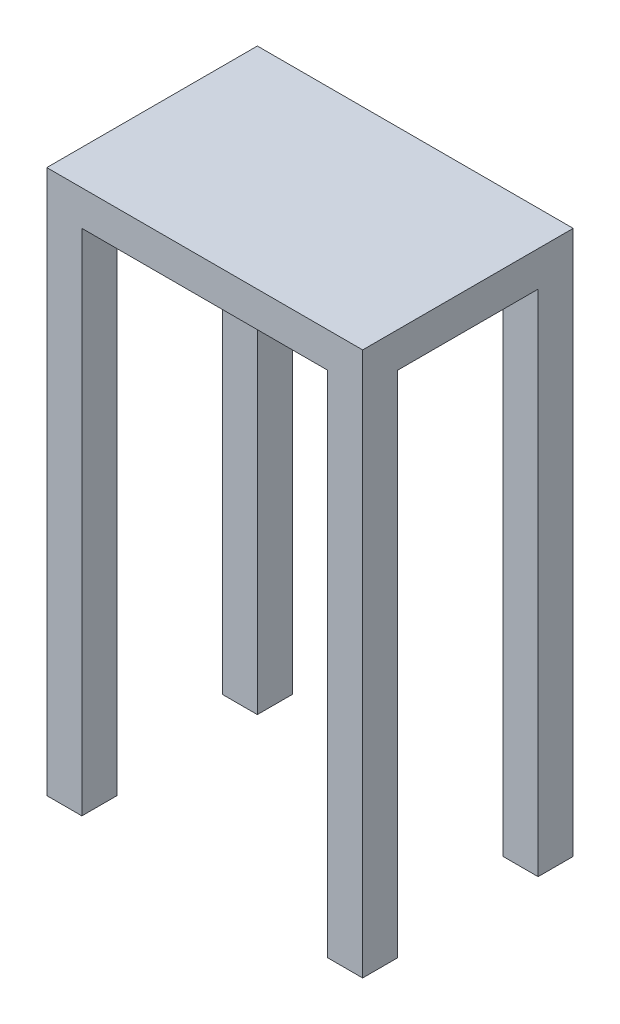
ISO-10303-21;
HEADER;
FILE_DESCRIPTION(('STEP AP214'),'2;1');
FILE_NAME('part.step','',(''),(''),'','','');
FILE_SCHEMA(('AUTOMOTIVE_DESIGN { 1 0 10303 214 1 1 1 1 }'));
ENDSEC;
DATA;
#1=APPLICATION_CONTEXT('core data for automotive mechanical design processes');
#2=APPLICATION_PROTOCOL_DEFINITION('international standard','automotive_design',2000,#1);
#3=PRODUCT_CONTEXT('',#1,'mechanical');
#4=PRODUCT('Part','Part','',(#3));
#5=PRODUCT_RELATED_PRODUCT_CATEGORY('part','',(#4));
#6=PRODUCT_DEFINITION_FORMATION('','',#4);
#7=PRODUCT_DEFINITION_CONTEXT('part definition',#1,'design');
#8=PRODUCT_DEFINITION('design','',#6,#7);
#9=PRODUCT_DEFINITION_SHAPE('','',#8);
#10=(LENGTH_UNIT() NAMED_UNIT(*) SI_UNIT(.MILLI.,.METRE.));
#11=(NAMED_UNIT(*) PLANE_ANGLE_UNIT() SI_UNIT($,.RADIAN.));
#12=(NAMED_UNIT(*) SI_UNIT($,.STERADIAN.) SOLID_ANGLE_UNIT());
#13=UNCERTAINTY_MEASURE_WITH_UNIT(LENGTH_MEASURE(1.E-05),#10,'distance_accuracy_value','');
#14=(GEOMETRIC_REPRESENTATION_CONTEXT(3) GLOBAL_UNCERTAINTY_ASSIGNED_CONTEXT((#13)) GLOBAL_UNIT_ASSIGNED_CONTEXT((#10,
#11,#12)) REPRESENTATION_CONTEXT('',''));
#15=CARTESIAN_POINT('',(0.,0.,0.));
#16=DIRECTION('',(0.,0.,1.));
#17=DIRECTION('',(1.,0.,0.));
#18=AXIS2_PLACEMENT_3D('',#15,#16,#17);
#19=CARTESIAN_POINT('',(0.,0.,0.));
#20=DIRECTION('',(0.,1.,0.));
#21=DIRECTION('',(0.,0.,1.));
#22=AXIS2_PLACEMENT_3D('',#19,#20,#21);
#23=PLANE('',#22);
#24=DIRECTION('',(0.,0.,1.));
#25=VECTOR('',#24,1.);
#26=CARTESIAN_POINT('',(-35.,0.,-30.));
#27=LINE('',#26,#25);
#28=CARTESIAN_POINT('',(-35.,0.,-30.));
#29=VERTEX_POINT('',#28);
#30=CARTESIAN_POINT('',(-35.,0.,-20.));
#31=VERTEX_POINT('',#30);
#32=EDGE_CURVE('E166',#29,#31,#27,.T.);
#33=ORIENTED_EDGE('',*,*,#32,.F.);
#34=DIRECTION('',(-1.,0.,0.));
#35=VECTOR('',#34,1.);
#36=CARTESIAN_POINT('',(45.,0.,-30.));
#37=LINE('',#36,#35);
#38=CARTESIAN_POINT('',(35.,0.,-30.));
#39=VERTEX_POINT('',#38);
#40=EDGE_CURVE('E192',#39,#29,#37,.T.);
#41=ORIENTED_EDGE('',*,*,#40,.F.);
#42=DIRECTION('',(0.,0.,-1.));
#43=VECTOR('',#42,1.);
#44=CARTESIAN_POINT('',(35.,0.,-20.));
#45=LINE('',#44,#43);
#46=CARTESIAN_POINT('',(35.,0.,-20.));
#47=VERTEX_POINT('',#46);
#48=EDGE_CURVE('E232',#47,#39,#45,.T.);
#49=ORIENTED_EDGE('',*,*,#48,.F.);
#50=DIRECTION('',(-1.,0.,0.));
#51=VECTOR('',#50,1.);
#52=CARTESIAN_POINT('',(35.,0.,-20.));
#53=LINE('',#52,#51);
#54=CARTESIAN_POINT('',(45.,0.,-20.));
#55=VERTEX_POINT('',#54);
#56=EDGE_CURVE('E234',#55,#47,#53,.T.);
#57=ORIENTED_EDGE('',*,*,#56,.F.);
#58=DIRECTION('',(0.,0.,-1.));
#59=VECTOR('',#58,1.);
#60=CARTESIAN_POINT('',(45.,0.,30.));
#61=LINE('',#60,#59);
#62=CARTESIAN_POINT('',(45.,0.,20.));
#63=VERTEX_POINT('',#62);
#64=EDGE_CURVE('E183',#63,#55,#61,.T.);
#65=ORIENTED_EDGE('',*,*,#64,.F.);
#66=DIRECTION('',(1.,0.,0.));
#67=VECTOR('',#66,1.);
#68=CARTESIAN_POINT('',(35.,0.,20.));
#69=LINE('',#68,#67);
#70=CARTESIAN_POINT('',(35.,0.,20.));
#71=VERTEX_POINT('',#70);
#72=EDGE_CURVE('E218',#71,#63,#69,.T.);
#73=ORIENTED_EDGE('',*,*,#72,.F.);
#74=DIRECTION('',(0.,0.,-1.));
#75=VECTOR('',#74,1.);
#76=CARTESIAN_POINT('',(35.,0.,20.));
#77=LINE('',#76,#75);
#78=CARTESIAN_POINT('',(35.,0.,30.));
#79=VERTEX_POINT('',#78);
#80=EDGE_CURVE('E220',#79,#71,#77,.T.);
#81=ORIENTED_EDGE('',*,*,#80,.F.);
#82=DIRECTION('',(1.,0.,0.));
#83=VECTOR('',#82,1.);
#84=CARTESIAN_POINT('',(45.,0.,30.));
#85=LINE('',#84,#83);
#86=CARTESIAN_POINT('',(-35.,0.,30.));
#87=VERTEX_POINT('',#86);
#88=EDGE_CURVE('E179',#87,#79,#85,.T.);
#89=ORIENTED_EDGE('',*,*,#88,.F.);
#90=DIRECTION('',(0.,0.,1.));
#91=VECTOR('',#90,1.);
#92=CARTESIAN_POINT('',(-35.,0.,30.));
#93=LINE('',#92,#91);
#94=CARTESIAN_POINT('',(-35.,0.,20.));
#95=VERTEX_POINT('',#94);
#96=EDGE_CURVE('E249',#95,#87,#93,.T.);
#97=ORIENTED_EDGE('',*,*,#96,.F.);
#98=DIRECTION('',(1.,0.,0.));
#99=VECTOR('',#98,1.);
#100=CARTESIAN_POINT('',(-45.,0.,20.));
#101=LINE('',#100,#99);
#102=CARTESIAN_POINT('',(-45.,0.,20.));
#103=VERTEX_POINT('',#102);
#104=EDGE_CURVE('E177',#103,#95,#101,.T.);
#105=ORIENTED_EDGE('',*,*,#104,.F.);
#106=DIRECTION('',(0.,0.,1.));
#107=VECTOR('',#106,1.);
#108=CARTESIAN_POINT('',(-45.,0.,30.));
#109=LINE('',#108,#107);
#110=CARTESIAN_POINT('',(-45.,0.,-20.));
#111=VERTEX_POINT('',#110);
#112=EDGE_CURVE('E171',#111,#103,#109,.T.);
#113=ORIENTED_EDGE('',*,*,#112,.F.);
#114=DIRECTION('',(-1.,0.,0.));
#115=VECTOR('',#114,1.);
#116=CARTESIAN_POINT('',(-45.,0.,-20.));
#117=LINE('',#116,#115);
#118=EDGE_CURVE('E155',#31,#111,#117,.T.);
#119=ORIENTED_EDGE('',*,*,#118,.F.);
#120=EDGE_LOOP('',(#33,#41,#49,#57,#65,#73,#81,#89,#97,#105,#113,#119));
#121=FACE_BOUND('',#120,.T.);
#122=ADVANCED_FACE('F39',(#121),#23,.F.);
#123=CARTESIAN_POINT('',(-45.,10.,30.));
#124=DIRECTION('',(1.,0.,0.));
#125=DIRECTION('',(0.,0.,-1.));
#126=AXIS2_PLACEMENT_3D('',#123,#124,#125);
#127=PLANE('',#126);
#128=DIRECTION('',(0.,-1.,0.));
#129=VECTOR('',#128,1.);
#130=CARTESIAN_POINT('',(-45.,10.,-30.));
#131=LINE('',#130,#129);
#132=CARTESIAN_POINT('',(-45.,10.,-30.));
#133=VERTEX_POINT('',#132);
#134=CARTESIAN_POINT('',(-45.,-145.,-30.));
#135=VERTEX_POINT('',#134);
#136=EDGE_CURVE('E195',#133,#135,#131,.T.);
#137=ORIENTED_EDGE('',*,*,#136,.T.);
#138=DIRECTION('',(0.,0.,-1.));
#139=VECTOR('',#138,1.);
#140=CARTESIAN_POINT('',(-45.,-145.,-30.));
#141=LINE('',#140,#139);
#142=CARTESIAN_POINT('',(-45.,-145.,-20.));
#143=VERTEX_POINT('',#142);
#144=EDGE_CURVE('E167',#143,#135,#141,.T.);
#145=ORIENTED_EDGE('',*,*,#144,.F.);
#146=DIRECTION('',(0.,1.,0.));
#147=VECTOR('',#146,1.);
#148=CARTESIAN_POINT('',(-45.,-145.,-20.));
#149=LINE('',#148,#147);
#150=EDGE_CURVE('E159',#143,#111,#149,.T.);
#151=ORIENTED_EDGE('',*,*,#150,.T.);
#152=ORIENTED_EDGE('',*,*,#112,.T.);
#153=DIRECTION('',(0.,1.,0.));
#154=VECTOR('',#153,1.);
#155=CARTESIAN_POINT('',(-45.,-145.,20.));
#156=LINE('',#155,#154);
#157=CARTESIAN_POINT('',(-45.,-145.,20.));
#158=VERTEX_POINT('',#157);
#159=EDGE_CURVE('E180',#158,#103,#156,.T.);
#160=ORIENTED_EDGE('',*,*,#159,.F.);
#161=DIRECTION('',(0.,0.,-1.));
#162=VECTOR('',#161,1.);
#163=CARTESIAN_POINT('',(-45.,-145.,30.));
#164=LINE('',#163,#162);
#165=CARTESIAN_POINT('',(-45.,-145.,30.));
#166=VERTEX_POINT('',#165);
#167=EDGE_CURVE('E245',#166,#158,#164,.T.);
#168=ORIENTED_EDGE('',*,*,#167,.F.);
#169=DIRECTION('',(0.,-1.,0.));
#170=VECTOR('',#169,1.);
#171=CARTESIAN_POINT('',(-45.,10.,30.));
#172=LINE('',#171,#170);
#173=CARTESIAN_POINT('',(-45.,10.,30.));
#174=VERTEX_POINT('',#173);
#175=EDGE_CURVE('E11',#174,#166,#172,.T.);
#176=ORIENTED_EDGE('',*,*,#175,.F.);
#177=DIRECTION('',(0.,0.,1.));
#178=VECTOR('',#177,1.);
#179=CARTESIAN_POINT('',(-45.,10.,30.));
#180=LINE('',#179,#178);
#181=EDGE_CURVE('E194',#133,#174,#180,.T.);
#182=ORIENTED_EDGE('',*,*,#181,.F.);
#183=EDGE_LOOP('',(#137,#145,#151,#152,#160,#168,#176,#182));
#184=FACE_BOUND('',#183,.T.);
#185=ADVANCED_FACE('F41',(#184),#127,.F.);
#186=CARTESIAN_POINT('',(45.,10.,30.));
#187=DIRECTION('',(0.,0.,-1.));
#188=DIRECTION('',(-1.,0.,0.));
#189=AXIS2_PLACEMENT_3D('',#186,#187,#188);
#190=PLANE('',#189);
#191=ORIENTED_EDGE('',*,*,#175,.T.);
#192=DIRECTION('',(-1.,0.,0.));
#193=VECTOR('',#192,1.);
#194=CARTESIAN_POINT('',(-45.,-145.,30.));
#195=LINE('',#194,#193);
#196=CARTESIAN_POINT('',(-35.,-145.,30.));
#197=VERTEX_POINT('',#196);
#198=EDGE_CURVE('E253',#197,#166,#195,.T.);
#199=ORIENTED_EDGE('',*,*,#198,.F.);
#200=DIRECTION('',(0.,1.,0.));
#201=VECTOR('',#200,1.);
#202=CARTESIAN_POINT('',(-35.,-145.,30.));
#203=LINE('',#202,#201);
#204=EDGE_CURVE('E256',#197,#87,#203,.T.);
#205=ORIENTED_EDGE('',*,*,#204,.T.);
#206=ORIENTED_EDGE('',*,*,#88,.T.);
#207=DIRECTION('',(0.,1.,0.));
#208=VECTOR('',#207,1.);
#209=CARTESIAN_POINT('',(35.,-145.,30.));
#210=LINE('',#209,#208);
#211=CARTESIAN_POINT('',(35.,-145.,30.));
#212=VERTEX_POINT('',#211);
#213=EDGE_CURVE('E210',#212,#79,#210,.T.);
#214=ORIENTED_EDGE('',*,*,#213,.F.);
#215=DIRECTION('',(-1.,0.,0.));
#216=VECTOR('',#215,1.);
#217=CARTESIAN_POINT('',(35.,-145.,30.));
#218=LINE('',#217,#216);
#219=CARTESIAN_POINT('',(45.,-145.,30.));
#220=VERTEX_POINT('',#219);
#221=EDGE_CURVE('E208',#220,#212,#218,.T.);
#222=ORIENTED_EDGE('',*,*,#221,.F.);
#223=DIRECTION('',(0.,-1.,0.));
#224=VECTOR('',#223,1.);
#225=CARTESIAN_POINT('',(45.,10.,30.));
#226=LINE('',#225,#224);
#227=CARTESIAN_POINT('',(45.,10.,30.));
#228=VERTEX_POINT('',#227);
#229=EDGE_CURVE('E47',#228,#220,#226,.T.);
#230=ORIENTED_EDGE('',*,*,#229,.F.);
#231=DIRECTION('',(1.,0.,0.));
#232=VECTOR('',#231,1.);
#233=CARTESIAN_POINT('',(45.,10.,30.));
#234=LINE('',#233,#232);
#235=EDGE_CURVE('E266',#174,#228,#234,.T.);
#236=ORIENTED_EDGE('',*,*,#235,.F.);
#237=EDGE_LOOP('',(#191,#199,#205,#206,#214,#222,#230,#236));
#238=FACE_BOUND('',#237,.T.);
#239=ADVANCED_FACE('F209',(#238),#190,.F.);
#240=CARTESIAN_POINT('',(45.,10.,30.));
#241=DIRECTION('',(-1.,0.,0.));
#242=DIRECTION('',(0.,0.,1.));
#243=AXIS2_PLACEMENT_3D('',#240,#241,#242);
#244=PLANE('',#243);
#245=ORIENTED_EDGE('',*,*,#229,.T.);
#246=DIRECTION('',(0.,0.,1.));
#247=VECTOR('',#246,1.);
#248=CARTESIAN_POINT('',(45.,-145.,20.));
#249=LINE('',#248,#247);
#250=CARTESIAN_POINT('',(45.,-145.,20.));
#251=VERTEX_POINT('',#250);
#252=EDGE_CURVE('E203',#251,#220,#249,.T.);
#253=ORIENTED_EDGE('',*,*,#252,.F.);
#254=DIRECTION('',(0.,1.,0.));
#255=VECTOR('',#254,1.);
#256=CARTESIAN_POINT('',(45.,-145.,20.));
#257=LINE('',#256,#255);
#258=EDGE_CURVE('E54',#251,#63,#257,.T.);
#259=ORIENTED_EDGE('',*,*,#258,.T.);
#260=ORIENTED_EDGE('',*,*,#64,.T.);
#261=DIRECTION('',(0.,1.,0.));
#262=VECTOR('',#261,1.);
#263=CARTESIAN_POINT('',(45.,-145.,-20.));
#264=LINE('',#263,#262);
#265=CARTESIAN_POINT('',(45.,-145.,-20.));
#266=VERTEX_POINT('',#265);
#267=EDGE_CURVE('E224',#266,#55,#264,.T.);
#268=ORIENTED_EDGE('',*,*,#267,.F.);
#269=DIRECTION('',(0.,0.,1.));
#270=VECTOR('',#269,1.);
#271=CARTESIAN_POINT('',(45.,-145.,-20.));
#272=LINE('',#271,#270);
#273=CARTESIAN_POINT('',(45.,-145.,-30.));
#274=VERTEX_POINT('',#273);
#275=EDGE_CURVE('E235',#274,#266,#272,.T.);
#276=ORIENTED_EDGE('',*,*,#275,.F.);
#277=DIRECTION('',(0.,-1.,0.));
#278=VECTOR('',#277,1.);
#279=CARTESIAN_POINT('',(45.,10.,-30.));
#280=LINE('',#279,#278);
#281=CARTESIAN_POINT('',(45.,10.,-30.));
#282=VERTEX_POINT('',#281);
#283=EDGE_CURVE('E197',#282,#274,#280,.T.);
#284=ORIENTED_EDGE('',*,*,#283,.F.);
#285=DIRECTION('',(0.,0.,-1.));
#286=VECTOR('',#285,1.);
#287=CARTESIAN_POINT('',(45.,10.,30.));
#288=LINE('',#287,#286);
#289=EDGE_CURVE('E205',#228,#282,#288,.T.);
#290=ORIENTED_EDGE('',*,*,#289,.F.);
#291=EDGE_LOOP('',(#245,#253,#259,#260,#268,#276,#284,#290));
#292=FACE_BOUND('',#291,.T.);
#293=ADVANCED_FACE('F201',(#292),#244,.F.);
#294=CARTESIAN_POINT('',(45.,10.,-30.));
#295=DIRECTION('',(0.,0.,1.));
#296=DIRECTION('',(1.,0.,0.));
#297=AXIS2_PLACEMENT_3D('',#294,#295,#296);
#298=PLANE('',#297);
#299=ORIENTED_EDGE('',*,*,#283,.T.);
#300=DIRECTION('',(1.,0.,0.));
#301=VECTOR('',#300,1.);
#302=CARTESIAN_POINT('',(35.,-145.,-30.));
#303=LINE('',#302,#301);
#304=CARTESIAN_POINT('',(35.,-145.,-30.));
#305=VERTEX_POINT('',#304);
#306=EDGE_CURVE('E231',#305,#274,#303,.T.);
#307=ORIENTED_EDGE('',*,*,#306,.F.);
#308=DIRECTION('',(0.,1.,0.));
#309=VECTOR('',#308,1.);
#310=CARTESIAN_POINT('',(35.,-145.,-30.));
#311=LINE('',#310,#309);
#312=EDGE_CURVE('E62',#305,#39,#311,.T.);
#313=ORIENTED_EDGE('',*,*,#312,.T.);
#314=ORIENTED_EDGE('',*,*,#40,.T.);
#315=DIRECTION('',(0.,1.,0.));
#316=VECTOR('',#315,1.);
#317=CARTESIAN_POINT('',(-35.,-145.,-30.));
#318=LINE('',#317,#316);
#319=CARTESIAN_POINT('',(-35.,-145.,-30.));
#320=VERTEX_POINT('',#319);
#321=EDGE_CURVE('E309',#320,#29,#318,.T.);
#322=ORIENTED_EDGE('',*,*,#321,.F.);
#323=DIRECTION('',(1.,0.,0.));
#324=VECTOR('',#323,1.);
#325=CARTESIAN_POINT('',(-45.,-145.,-30.));
#326=LINE('',#325,#324);
#327=EDGE_CURVE('E276',#135,#320,#326,.T.);
#328=ORIENTED_EDGE('',*,*,#327,.F.);
#329=ORIENTED_EDGE('',*,*,#136,.F.);
#330=DIRECTION('',(-1.,0.,0.));
#331=VECTOR('',#330,1.);
#332=CARTESIAN_POINT('',(45.,10.,-30.));
#333=LINE('',#332,#331);
#334=EDGE_CURVE('E188',#282,#133,#333,.T.);
#335=ORIENTED_EDGE('',*,*,#334,.F.);
#336=EDGE_LOOP('',(#299,#307,#313,#314,#322,#328,#329,#335));
#337=FACE_BOUND('',#336,.T.);
#338=ADVANCED_FACE('F274',(#337),#298,.F.);
#339=CARTESIAN_POINT('',(0.,10.,0.));
#340=DIRECTION('',(0.,1.,0.));
#341=DIRECTION('',(0.,0.,1.));
#342=AXIS2_PLACEMENT_3D('',#339,#340,#341);
#343=PLANE('',#342);
#344=ORIENTED_EDGE('',*,*,#181,.T.);
#345=ORIENTED_EDGE('',*,*,#235,.T.);
#346=ORIENTED_EDGE('',*,*,#289,.T.);
#347=ORIENTED_EDGE('',*,*,#334,.T.);
#348=EDGE_LOOP('',(#344,#345,#346,#347));
#349=FACE_BOUND('',#348,.T.);
#350=ADVANCED_FACE('F270',(#349),#343,.T.);
#351=CARTESIAN_POINT('',(-45.,-145.,20.));
#352=DIRECTION('',(0.,0.,1.));
#353=DIRECTION('',(1.,0.,0.));
#354=AXIS2_PLACEMENT_3D('',#351,#352,#353);
#355=PLANE('',#354);
#356=ORIENTED_EDGE('',*,*,#104,.T.);
#357=DIRECTION('',(0.,1.,0.));
#358=VECTOR('',#357,1.);
#359=CARTESIAN_POINT('',(-35.,-145.,20.));
#360=LINE('',#359,#358);
#361=CARTESIAN_POINT('',(-35.,-145.,20.));
#362=VERTEX_POINT('',#361);
#363=EDGE_CURVE('E185',#362,#95,#360,.T.);
#364=ORIENTED_EDGE('',*,*,#363,.F.);
#365=DIRECTION('',(1.,0.,0.));
#366=VECTOR('',#365,1.);
#367=CARTESIAN_POINT('',(-45.,-145.,20.));
#368=LINE('',#367,#366);
#369=EDGE_CURVE('E248',#158,#362,#368,.T.);
#370=ORIENTED_EDGE('',*,*,#369,.F.);
#371=ORIENTED_EDGE('',*,*,#159,.T.);
#372=EDGE_LOOP('',(#356,#364,#370,#371));
#373=FACE_BOUND('',#372,.T.);
#374=ADVANCED_FACE('F367',(#373),#355,.F.);
#375=CARTESIAN_POINT('',(-35.,-145.,30.));
#376=DIRECTION('',(-1.,0.,0.));
#377=DIRECTION('',(0.,0.,1.));
#378=AXIS2_PLACEMENT_3D('',#375,#376,#377);
#379=PLANE('',#378);
#380=ORIENTED_EDGE('',*,*,#96,.T.);
#381=ORIENTED_EDGE('',*,*,#204,.F.);
#382=DIRECTION('',(0.,0.,1.));
#383=VECTOR('',#382,1.);
#384=CARTESIAN_POINT('',(-35.,-145.,30.));
#385=LINE('',#384,#383);
#386=EDGE_CURVE('E251',#362,#197,#385,.T.);
#387=ORIENTED_EDGE('',*,*,#386,.F.);
#388=ORIENTED_EDGE('',*,*,#363,.T.);
#389=EDGE_LOOP('',(#380,#381,#387,#388));
#390=FACE_BOUND('',#389,.T.);
#391=ADVANCED_FACE('F285',(#390),#379,.F.);
#392=CARTESIAN_POINT('',(0.,-145.,0.));
#393=DIRECTION('',(0.,-1.,0.));
#394=DIRECTION('',(0.,0.,-1.));
#395=AXIS2_PLACEMENT_3D('',#392,#393,#394);
#396=PLANE('',#395);
#397=ORIENTED_EDGE('',*,*,#167,.T.);
#398=ORIENTED_EDGE('',*,*,#369,.T.);
#399=ORIENTED_EDGE('',*,*,#386,.T.);
#400=ORIENTED_EDGE('',*,*,#198,.T.);
#401=EDGE_LOOP('',(#397,#398,#399,#400));
#402=FACE_BOUND('',#401,.T.);
#403=ADVANCED_FACE('F280',(#402),#396,.T.);
#404=CARTESIAN_POINT('',(35.,-145.,-20.));
#405=DIRECTION('',(0.,0.,-1.));
#406=DIRECTION('',(-1.,0.,0.));
#407=AXIS2_PLACEMENT_3D('',#404,#405,#406);
#408=PLANE('',#407);
#409=ORIENTED_EDGE('',*,*,#56,.T.);
#410=DIRECTION('',(0.,1.,0.));
#411=VECTOR('',#410,1.);
#412=CARTESIAN_POINT('',(35.,-145.,-20.));
#413=LINE('',#412,#411);
#414=CARTESIAN_POINT('',(35.,-145.,-20.));
#415=VERTEX_POINT('',#414);
#416=EDGE_CURVE('E227',#415,#47,#413,.T.);
#417=ORIENTED_EDGE('',*,*,#416,.F.);
#418=DIRECTION('',(-1.,0.,0.));
#419=VECTOR('',#418,1.);
#420=CARTESIAN_POINT('',(35.,-145.,-20.));
#421=LINE('',#420,#419);
#422=EDGE_CURVE('E241',#266,#415,#421,.T.);
#423=ORIENTED_EDGE('',*,*,#422,.F.);
#424=ORIENTED_EDGE('',*,*,#267,.T.);
#425=EDGE_LOOP('',(#409,#417,#423,#424));
#426=FACE_BOUND('',#425,.T.);
#427=ADVANCED_FACE('F321',(#426),#408,.F.);
#428=CARTESIAN_POINT('',(35.,-145.,-20.));
#429=DIRECTION('',(1.,0.,0.));
#430=DIRECTION('',(0.,0.,-1.));
#431=AXIS2_PLACEMENT_3D('',#428,#429,#430);
#432=PLANE('',#431);
#433=ORIENTED_EDGE('',*,*,#48,.T.);
#434=ORIENTED_EDGE('',*,*,#312,.F.);
#435=DIRECTION('',(0.,0.,-1.));
#436=VECTOR('',#435,1.);
#437=CARTESIAN_POINT('',(35.,-145.,-20.));
#438=LINE('',#437,#436);
#439=EDGE_CURVE('E239',#415,#305,#438,.T.);
#440=ORIENTED_EDGE('',*,*,#439,.F.);
#441=ORIENTED_EDGE('',*,*,#416,.T.);
#442=EDGE_LOOP('',(#433,#434,#440,#441));
#443=FACE_BOUND('',#442,.T.);
#444=ADVANCED_FACE('F317',(#443),#432,.F.);
#445=CARTESIAN_POINT('',(0.,-145.,0.));
#446=DIRECTION('',(0.,-1.,0.));
#447=DIRECTION('',(0.,0.,-1.));
#448=AXIS2_PLACEMENT_3D('',#445,#446,#447);
#449=PLANE('',#448);
#450=ORIENTED_EDGE('',*,*,#275,.T.);
#451=ORIENTED_EDGE('',*,*,#422,.T.);
#452=ORIENTED_EDGE('',*,*,#439,.T.);
#453=ORIENTED_EDGE('',*,*,#306,.T.);
#454=EDGE_LOOP('',(#450,#451,#452,#453));
#455=FACE_BOUND('',#454,.T.);
#456=ADVANCED_FACE('F325',(#455),#449,.T.);
#457=CARTESIAN_POINT('',(35.,-145.,20.));
#458=DIRECTION('',(1.,0.,0.));
#459=DIRECTION('',(0.,0.,-1.));
#460=AXIS2_PLACEMENT_3D('',#457,#458,#459);
#461=PLANE('',#460);
#462=ORIENTED_EDGE('',*,*,#80,.T.);
#463=DIRECTION('',(0.,1.,0.));
#464=VECTOR('',#463,1.);
#465=CARTESIAN_POINT('',(35.,-145.,20.));
#466=LINE('',#465,#464);
#467=CARTESIAN_POINT('',(35.,-145.,20.));
#468=VERTEX_POINT('',#467);
#469=EDGE_CURVE('E295',#468,#71,#466,.T.);
#470=ORIENTED_EDGE('',*,*,#469,.F.);
#471=DIRECTION('',(0.,0.,-1.));
#472=VECTOR('',#471,1.);
#473=CARTESIAN_POINT('',(35.,-145.,20.));
#474=LINE('',#473,#472);
#475=EDGE_CURVE('E213',#212,#468,#474,.T.);
#476=ORIENTED_EDGE('',*,*,#475,.F.);
#477=ORIENTED_EDGE('',*,*,#213,.T.);
#478=EDGE_LOOP('',(#462,#470,#476,#477));
#479=FACE_BOUND('',#478,.T.);
#480=ADVANCED_FACE('F296',(#479),#461,.F.);
#481=CARTESIAN_POINT('',(35.,-145.,20.));
#482=DIRECTION('',(0.,0.,1.));
#483=DIRECTION('',(1.,0.,0.));
#484=AXIS2_PLACEMENT_3D('',#481,#482,#483);
#485=PLANE('',#484);
#486=ORIENTED_EDGE('',*,*,#72,.T.);
#487=ORIENTED_EDGE('',*,*,#258,.F.);
#488=DIRECTION('',(1.,0.,0.));
#489=VECTOR('',#488,1.);
#490=CARTESIAN_POINT('',(35.,-145.,20.));
#491=LINE('',#490,#489);
#492=EDGE_CURVE('E217',#468,#251,#491,.T.);
#493=ORIENTED_EDGE('',*,*,#492,.F.);
#494=ORIENTED_EDGE('',*,*,#469,.T.);
#495=EDGE_LOOP('',(#486,#487,#493,#494));
#496=FACE_BOUND('',#495,.T.);
#497=ADVANCED_FACE('F299',(#496),#485,.F.);
#498=CARTESIAN_POINT('',(0.,-145.,0.));
#499=DIRECTION('',(0.,1.,0.));
#500=DIRECTION('',(0.,0.,1.));
#501=AXIS2_PLACEMENT_3D('',#498,#499,#500);
#502=PLANE('',#501);
#503=ORIENTED_EDGE('',*,*,#252,.T.);
#504=ORIENTED_EDGE('',*,*,#221,.T.);
#505=ORIENTED_EDGE('',*,*,#475,.T.);
#506=ORIENTED_EDGE('',*,*,#492,.T.);
#507=EDGE_LOOP('',(#503,#504,#505,#506));
#508=FACE_BOUND('',#507,.T.);
#509=ADVANCED_FACE('F215',(#508),#502,.F.);
#510=CARTESIAN_POINT('',(-35.,-145.,-30.));
#511=DIRECTION('',(-1.,0.,0.));
#512=DIRECTION('',(0.,0.,1.));
#513=AXIS2_PLACEMENT_3D('',#510,#511,#512);
#514=PLANE('',#513);
#515=ORIENTED_EDGE('',*,*,#32,.T.);
#516=DIRECTION('',(0.,1.,0.));
#517=VECTOR('',#516,1.);
#518=CARTESIAN_POINT('',(-35.,-145.,-20.));
#519=LINE('',#518,#517);
#520=CARTESIAN_POINT('',(-35.,-145.,-20.));
#521=VERTEX_POINT('',#520);
#522=EDGE_CURVE('E162',#521,#31,#519,.T.);
#523=ORIENTED_EDGE('',*,*,#522,.F.);
#524=DIRECTION('',(0.,0.,1.));
#525=VECTOR('',#524,1.);
#526=CARTESIAN_POINT('',(-35.,-145.,-30.));
#527=LINE('',#526,#525);
#528=EDGE_CURVE('E304',#320,#521,#527,.T.);
#529=ORIENTED_EDGE('',*,*,#528,.F.);
#530=ORIENTED_EDGE('',*,*,#321,.T.);
#531=EDGE_LOOP('',(#515,#523,#529,#530));
#532=FACE_BOUND('',#531,.T.);
#533=ADVANCED_FACE('F312',(#532),#514,.F.);
#534=CARTESIAN_POINT('',(-45.,-145.,-20.));
#535=DIRECTION('',(0.,0.,-1.));
#536=DIRECTION('',(-1.,0.,0.));
#537=AXIS2_PLACEMENT_3D('',#534,#535,#536);
#538=PLANE('',#537);
#539=ORIENTED_EDGE('',*,*,#118,.T.);
#540=ORIENTED_EDGE('',*,*,#150,.F.);
#541=DIRECTION('',(-1.,0.,0.));
#542=VECTOR('',#541,1.);
#543=CARTESIAN_POINT('',(-45.,-145.,-20.));
#544=LINE('',#543,#542);
#545=EDGE_CURVE('E174',#521,#143,#544,.T.);
#546=ORIENTED_EDGE('',*,*,#545,.F.);
#547=ORIENTED_EDGE('',*,*,#522,.T.);
#548=EDGE_LOOP('',(#539,#540,#546,#547));
#549=FACE_BOUND('',#548,.T.);
#550=ADVANCED_FACE('F157',(#549),#538,.F.);
#551=CARTESIAN_POINT('',(0.,-145.,0.));
#552=DIRECTION('',(0.,1.,0.));
#553=DIRECTION('',(0.,0.,1.));
#554=AXIS2_PLACEMENT_3D('',#551,#552,#553);
#555=PLANE('',#554);
#556=ORIENTED_EDGE('',*,*,#144,.T.);
#557=ORIENTED_EDGE('',*,*,#327,.T.);
#558=ORIENTED_EDGE('',*,*,#528,.T.);
#559=ORIENTED_EDGE('',*,*,#545,.T.);
#560=EDGE_LOOP('',(#556,#557,#558,#559));
#561=FACE_BOUND('',#560,.T.);
#562=ADVANCED_FACE('F439',(#561),#555,.F.);
#563=CLOSED_SHELL('',(#122,#185,#239,#293,#338,#350,#374,#391,#403,#427,#444,#456,#480,#497,
#509,#533,#550,#562));
#564=MANIFOLD_SOLID_BREP('B2',#563);
#565=ADVANCED_BREP_SHAPE_REPRESENTATION('',(#18,#564),#14);
#566=SHAPE_DEFINITION_REPRESENTATION(#9,#565);
ENDSEC;
END-ISO-10303-21;
